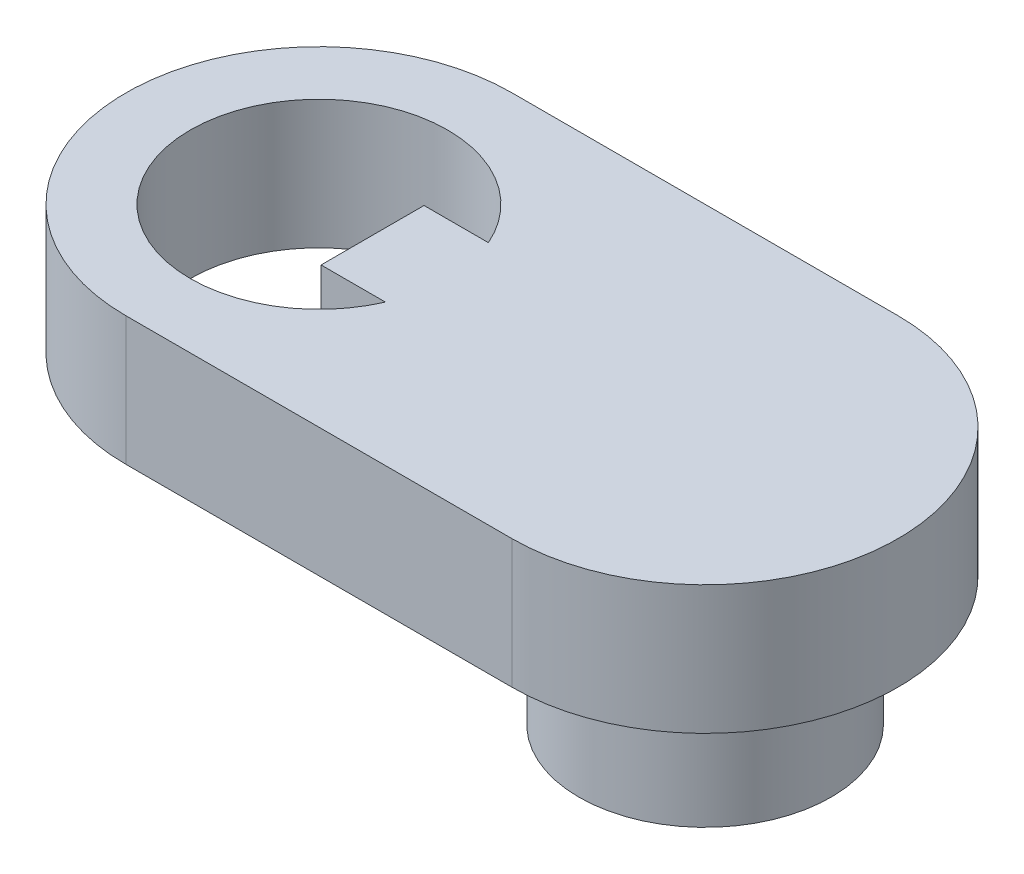
ISO-10303-21;
HEADER;
FILE_DESCRIPTION(('STEP AP214'),'2;1');
FILE_NAME('part.step','',(''),(''),'','','');
FILE_SCHEMA(('AUTOMOTIVE_DESIGN { 1 0 10303 214 1 1 1 1 }'));
ENDSEC;
DATA;
#1=APPLICATION_CONTEXT('core data for automotive mechanical design processes');
#2=APPLICATION_PROTOCOL_DEFINITION('international standard','automotive_design',2000,#1);
#3=PRODUCT_CONTEXT('',#1,'mechanical');
#4=PRODUCT('Part','Part','',(#3));
#5=PRODUCT_RELATED_PRODUCT_CATEGORY('part','',(#4));
#6=PRODUCT_DEFINITION_FORMATION('','',#4);
#7=PRODUCT_DEFINITION_CONTEXT('part definition',#1,'design');
#8=PRODUCT_DEFINITION('design','',#6,#7);
#9=PRODUCT_DEFINITION_SHAPE('','',#8);
#10=(LENGTH_UNIT() NAMED_UNIT(*) SI_UNIT(.MILLI.,.METRE.));
#11=(NAMED_UNIT(*) PLANE_ANGLE_UNIT() SI_UNIT($,.RADIAN.));
#12=(NAMED_UNIT(*) SI_UNIT($,.STERADIAN.) SOLID_ANGLE_UNIT());
#13=UNCERTAINTY_MEASURE_WITH_UNIT(LENGTH_MEASURE(1.E-05),#10,'distance_accuracy_value','');
#14=(GEOMETRIC_REPRESENTATION_CONTEXT(3) GLOBAL_UNCERTAINTY_ASSIGNED_CONTEXT((#13)) GLOBAL_UNIT_ASSIGNED_CONTEXT((#10,
#11,#12)) REPRESENTATION_CONTEXT('',''));
#15=CARTESIAN_POINT('',(0.,0.,0.));
#16=DIRECTION('',(0.,0.,1.));
#17=DIRECTION('',(1.,0.,0.));
#18=AXIS2_PLACEMENT_3D('',#15,#16,#17);
#19=CARTESIAN_POINT('',(15.,5.,-7.5));
#20=DIRECTION('',(0.,-1.,0.));
#21=DIRECTION('',(0.,0.,-1.));
#22=AXIS2_PLACEMENT_3D('',#19,#20,#21);
#23=CYLINDRICAL_SURFACE('',#22,5.);
#24=CARTESIAN_POINT('',(15.,0.,-7.5));
#25=DIRECTION('',(0.,1.,0.));
#26=DIRECTION('',(0.,0.,1.));
#27=AXIS2_PLACEMENT_3D('',#24,#25,#26);
#28=CIRCLE('',#27,5.);
#29=CARTESIAN_POINT('',(15.,0.,-2.5));
#30=VERTEX_POINT('',#29);
#31=EDGE_CURVE('E116',#30,#30,#28,.T.);
#32=ORIENTED_EDGE('',*,*,#31,.F.);
#33=EDGE_LOOP('',(#32));
#34=FACE_BOUND('',#33,.T.);
#35=CARTESIAN_POINT('',(15.,4.,-7.5));
#36=DIRECTION('',(0.,1.,0.));
#37=DIRECTION('',(0.,0.,1.));
#38=AXIS2_PLACEMENT_3D('',#35,#36,#37);
#39=CIRCLE('',#38,5.);
#40=CARTESIAN_POINT('',(15.,4.,-2.5));
#41=VERTEX_POINT('',#40);
#42=EDGE_CURVE('E129',#41,#41,#39,.T.);
#43=ORIENTED_EDGE('',*,*,#42,.T.);
#44=EDGE_LOOP('',(#43));
#45=FACE_BOUND('',#44,.T.);
#46=ADVANCED_FACE('F34',(#34,#45),#23,.F.);
#47=CARTESIAN_POINT('',(0.,5.,-7.5));
#48=DIRECTION('',(0.,1.,0.));
#49=DIRECTION('',(0.,0.,1.));
#50=AXIS2_PLACEMENT_3D('',#47,#48,#49);
#51=PLANE('',#50);
#52=CARTESIAN_POINT('',(0.,5.,-7.5));
#53=DIRECTION('',(0.,1.,0.));
#54=DIRECTION('',(0.,0.,1.));
#55=AXIS2_PLACEMENT_3D('',#52,#53,#54);
#56=CIRCLE('',#55,7.5);
#57=CARTESIAN_POINT('',(0.,5.,-15.));
#58=VERTEX_POINT('',#57);
#59=CARTESIAN_POINT('',(0.,5.,0.));
#60=VERTEX_POINT('',#59);
#61=EDGE_CURVE('E142',#58,#60,#56,.T.);
#62=ORIENTED_EDGE('',*,*,#61,.T.);
#63=DIRECTION('',(1.,0.,0.));
#64=VECTOR('',#63,1.);
#65=CARTESIAN_POINT('',(0.,5.,0.));
#66=LINE('',#65,#64);
#67=CARTESIAN_POINT('',(15.,5.,0.));
#68=VERTEX_POINT('',#67);
#69=EDGE_CURVE('E145',#60,#68,#66,.T.);
#70=ORIENTED_EDGE('',*,*,#69,.T.);
#71=CARTESIAN_POINT('',(15.,5.,-7.5));
#72=DIRECTION('',(0.,1.,0.));
#73=DIRECTION('',(0.,0.,1.));
#74=AXIS2_PLACEMENT_3D('',#71,#72,#73);
#75=CIRCLE('',#74,7.5);
#76=CARTESIAN_POINT('',(15.,5.,-15.));
#77=VERTEX_POINT('',#76);
#78=EDGE_CURVE('E148',#68,#77,#75,.T.);
#79=ORIENTED_EDGE('',*,*,#78,.T.);
#80=DIRECTION('',(-1.,0.,0.));
#81=VECTOR('',#80,1.);
#82=CARTESIAN_POINT('',(0.,5.,-15.));
#83=LINE('',#82,#81);
#84=EDGE_CURVE('E150',#77,#58,#83,.T.);
#85=ORIENTED_EDGE('',*,*,#84,.T.);
#86=EDGE_LOOP('',(#62,#70,#79,#85));
#87=FACE_BOUND('',#86,.T.);
#88=DIRECTION('',(-1.,0.,0.));
#89=VECTOR('',#88,1.);
#90=CARTESIAN_POINT('',(4.58257569495584,5.,-5.5));
#91=LINE('',#90,#89);
#92=CARTESIAN_POINT('',(4.58257569495584,5.,-5.5));
#93=VERTEX_POINT('',#92);
#94=CARTESIAN_POINT('',(2.08257569495584,5.,-5.5));
#95=VERTEX_POINT('',#94);
#96=EDGE_CURVE('E108',#93,#95,#91,.T.);
#97=ORIENTED_EDGE('',*,*,#96,.F.);
#98=CARTESIAN_POINT('',(0.,5.,-7.5));
#99=DIRECTION('',(0.,1.,0.));
#100=DIRECTION('',(0.,0.,1.));
#101=AXIS2_PLACEMENT_3D('',#98,#99,#100);
#102=CIRCLE('',#101,5.);
#103=CARTESIAN_POINT('',(4.58257569495584,5.,-9.5));
#104=VERTEX_POINT('',#103);
#105=EDGE_CURVE('E100',#104,#93,#102,.T.);
#106=ORIENTED_EDGE('',*,*,#105,.F.);
#107=DIRECTION('',(1.,0.,0.));
#108=VECTOR('',#107,1.);
#109=CARTESIAN_POINT('',(2.08257569495584,5.,-9.5));
#110=LINE('',#109,#108);
#111=CARTESIAN_POINT('',(2.08257569495584,5.,-9.5));
#112=VERTEX_POINT('',#111);
#113=EDGE_CURVE('E123',#112,#104,#110,.T.);
#114=ORIENTED_EDGE('',*,*,#113,.F.);
#115=DIRECTION('',(0.,0.,-1.));
#116=VECTOR('',#115,1.);
#117=CARTESIAN_POINT('',(2.08257569495584,5.,-5.5));
#118=LINE('',#117,#116);
#119=EDGE_CURVE('E121',#95,#112,#118,.T.);
#120=ORIENTED_EDGE('',*,*,#119,.F.);
#121=EDGE_LOOP('',(#97,#106,#114,#120));
#122=FACE_BOUND('',#121,.T.);
#123=ADVANCED_FACE('F120',(#87,#122),#51,.T.);
#124=CARTESIAN_POINT('',(0.,0.,-7.5));
#125=DIRECTION('',(0.,1.,0.));
#126=DIRECTION('',(0.,0.,1.));
#127=AXIS2_PLACEMENT_3D('',#124,#125,#126);
#128=PLANE('',#127);
#129=ORIENTED_EDGE('',*,*,#31,.T.);
#130=EDGE_LOOP('',(#129));
#131=FACE_BOUND('',#130,.T.);
#132=CARTESIAN_POINT('',(0.,0.,-7.5));
#133=DIRECTION('',(0.,1.,0.));
#134=DIRECTION('',(0.,0.,1.));
#135=AXIS2_PLACEMENT_3D('',#132,#133,#134);
#136=CIRCLE('',#135,7.5);
#137=CARTESIAN_POINT('',(0.,0.,-15.));
#138=VERTEX_POINT('',#137);
#139=CARTESIAN_POINT('',(0.,0.,0.));
#140=VERTEX_POINT('',#139);
#141=EDGE_CURVE('E141',#138,#140,#136,.T.);
#142=ORIENTED_EDGE('',*,*,#141,.F.);
#143=DIRECTION('',(-1.,0.,0.));
#144=VECTOR('',#143,1.);
#145=CARTESIAN_POINT('',(0.,0.,-15.));
#146=LINE('',#145,#144);
#147=CARTESIAN_POINT('',(15.,0.,-15.));
#148=VERTEX_POINT('',#147);
#149=EDGE_CURVE('E146',#148,#138,#146,.T.);
#150=ORIENTED_EDGE('',*,*,#149,.F.);
#151=CARTESIAN_POINT('',(15.,0.,-7.5));
#152=DIRECTION('',(0.,1.,0.));
#153=DIRECTION('',(0.,0.,1.));
#154=AXIS2_PLACEMENT_3D('',#151,#152,#153);
#155=CIRCLE('',#154,7.5);
#156=CARTESIAN_POINT('',(15.,0.,0.));
#157=VERTEX_POINT('',#156);
#158=EDGE_CURVE('E157',#157,#148,#155,.T.);
#159=ORIENTED_EDGE('',*,*,#158,.F.);
#160=DIRECTION('',(1.,0.,0.));
#161=VECTOR('',#160,1.);
#162=CARTESIAN_POINT('',(0.,0.,0.));
#163=LINE('',#162,#161);
#164=EDGE_CURVE('E155',#140,#157,#163,.T.);
#165=ORIENTED_EDGE('',*,*,#164,.F.);
#166=EDGE_LOOP('',(#142,#150,#159,#165));
#167=FACE_BOUND('',#166,.T.);
#168=CARTESIAN_POINT('',(0.,0.,-7.5));
#169=DIRECTION('',(0.,1.,0.));
#170=DIRECTION('',(0.,0.,1.));
#171=AXIS2_PLACEMENT_3D('',#168,#169,#170);
#172=CIRCLE('',#171,5.);
#173=CARTESIAN_POINT('',(4.58257569495584,0.,-9.5));
#174=VERTEX_POINT('',#173);
#175=CARTESIAN_POINT('',(4.58257569495584,0.,-5.5));
#176=VERTEX_POINT('',#175);
#177=EDGE_CURVE('E58',#174,#176,#172,.T.);
#178=ORIENTED_EDGE('',*,*,#177,.T.);
#179=DIRECTION('',(-1.,0.,0.));
#180=VECTOR('',#179,1.);
#181=CARTESIAN_POINT('',(4.58257569495584,0.,-5.5));
#182=LINE('',#181,#180);
#183=CARTESIAN_POINT('',(2.08257569495584,0.,-5.5));
#184=VERTEX_POINT('',#183);
#185=EDGE_CURVE('E115',#176,#184,#182,.T.);
#186=ORIENTED_EDGE('',*,*,#185,.T.);
#187=DIRECTION('',(0.,0.,-1.));
#188=VECTOR('',#187,1.);
#189=CARTESIAN_POINT('',(2.08257569495584,0.,-5.5));
#190=LINE('',#189,#188);
#191=CARTESIAN_POINT('',(2.08257569495584,0.,-9.5));
#192=VERTEX_POINT('',#191);
#193=EDGE_CURVE('E131',#184,#192,#190,.T.);
#194=ORIENTED_EDGE('',*,*,#193,.T.);
#195=DIRECTION('',(1.,0.,0.));
#196=VECTOR('',#195,1.);
#197=CARTESIAN_POINT('',(2.08257569495584,0.,-9.5));
#198=LINE('',#197,#196);
#199=EDGE_CURVE('E109',#192,#174,#198,.T.);
#200=ORIENTED_EDGE('',*,*,#199,.T.);
#201=EDGE_LOOP('',(#178,#186,#194,#200));
#202=FACE_BOUND('',#201,.T.);
#203=ADVANCED_FACE('F176',(#131,#167,#202),#128,.F.);
#204=CARTESIAN_POINT('',(0.,5.,-7.5));
#205=DIRECTION('',(0.,-1.,0.));
#206=DIRECTION('',(0.,0.,-1.));
#207=AXIS2_PLACEMENT_3D('',#204,#205,#206);
#208=CYLINDRICAL_SURFACE('',#207,7.5);
#209=ORIENTED_EDGE('',*,*,#141,.T.);
#210=DIRECTION('',(0.,-1.,0.));
#211=VECTOR('',#210,1.);
#212=CARTESIAN_POINT('',(0.,5.,0.));
#213=LINE('',#212,#211);
#214=EDGE_CURVE('E11',#60,#140,#213,.T.);
#215=ORIENTED_EDGE('',*,*,#214,.F.);
#216=ORIENTED_EDGE('',*,*,#61,.F.);
#217=DIRECTION('',(0.,-1.,0.));
#218=VECTOR('',#217,1.);
#219=CARTESIAN_POINT('',(0.,5.,-15.));
#220=LINE('',#219,#218);
#221=EDGE_CURVE('E152',#58,#138,#220,.T.);
#222=ORIENTED_EDGE('',*,*,#221,.T.);
#223=EDGE_LOOP('',(#209,#215,#216,#222));
#224=FACE_BOUND('',#223,.T.);
#225=ADVANCED_FACE('F36',(#224),#208,.T.);
#226=CARTESIAN_POINT('',(0.,5.,0.));
#227=DIRECTION('',(0.,0.,-1.));
#228=DIRECTION('',(-1.,0.,0.));
#229=AXIS2_PLACEMENT_3D('',#226,#227,#228);
#230=PLANE('',#229);
#231=ORIENTED_EDGE('',*,*,#164,.T.);
#232=DIRECTION('',(0.,-1.,0.));
#233=VECTOR('',#232,1.);
#234=CARTESIAN_POINT('',(15.,5.,0.));
#235=LINE('',#234,#233);
#236=EDGE_CURVE('E43',#68,#157,#235,.T.);
#237=ORIENTED_EDGE('',*,*,#236,.F.);
#238=ORIENTED_EDGE('',*,*,#69,.F.);
#239=ORIENTED_EDGE('',*,*,#214,.T.);
#240=EDGE_LOOP('',(#231,#237,#238,#239));
#241=FACE_BOUND('',#240,.T.);
#242=ADVANCED_FACE('F186',(#241),#230,.F.);
#243=CARTESIAN_POINT('',(15.,5.,-7.5));
#244=DIRECTION('',(0.,-1.,0.));
#245=DIRECTION('',(0.,0.,-1.));
#246=AXIS2_PLACEMENT_3D('',#243,#244,#245);
#247=CYLINDRICAL_SURFACE('',#246,7.5);
#248=ORIENTED_EDGE('',*,*,#158,.T.);
#249=DIRECTION('',(0.,-1.,0.));
#250=VECTOR('',#249,1.);
#251=CARTESIAN_POINT('',(15.,5.,-15.));
#252=LINE('',#251,#250);
#253=EDGE_CURVE('E162',#77,#148,#252,.T.);
#254=ORIENTED_EDGE('',*,*,#253,.F.);
#255=ORIENTED_EDGE('',*,*,#78,.F.);
#256=ORIENTED_EDGE('',*,*,#236,.T.);
#257=EDGE_LOOP('',(#248,#254,#255,#256));
#258=FACE_BOUND('',#257,.T.);
#259=ADVANCED_FACE('F170',(#258),#247,.T.);
#260=CARTESIAN_POINT('',(0.,5.,-15.));
#261=DIRECTION('',(0.,0.,1.));
#262=DIRECTION('',(1.,0.,0.));
#263=AXIS2_PLACEMENT_3D('',#260,#261,#262);
#264=PLANE('',#263);
#265=ORIENTED_EDGE('',*,*,#149,.T.);
#266=ORIENTED_EDGE('',*,*,#221,.F.);
#267=ORIENTED_EDGE('',*,*,#84,.F.);
#268=ORIENTED_EDGE('',*,*,#253,.T.);
#269=EDGE_LOOP('',(#265,#266,#267,#268));
#270=FACE_BOUND('',#269,.T.);
#271=ADVANCED_FACE('F180',(#270),#264,.F.);
#272=CARTESIAN_POINT('',(0.,5.,-7.5));
#273=DIRECTION('',(0.,-1.,0.));
#274=DIRECTION('',(0.,0.,-1.));
#275=AXIS2_PLACEMENT_3D('',#272,#273,#274);
#276=CYLINDRICAL_SURFACE('',#275,5.);
#277=ORIENTED_EDGE('',*,*,#177,.F.);
#278=DIRECTION('',(0.,-1.,0.));
#279=VECTOR('',#278,1.);
#280=CARTESIAN_POINT('',(4.58257569495584,5.,-9.5));
#281=LINE('',#280,#279);
#282=EDGE_CURVE('E104',#104,#174,#281,.T.);
#283=ORIENTED_EDGE('',*,*,#282,.F.);
#284=ORIENTED_EDGE('',*,*,#105,.T.);
#285=DIRECTION('',(0.,-1.,0.));
#286=VECTOR('',#285,1.);
#287=CARTESIAN_POINT('',(4.58257569495584,5.,-5.5));
#288=LINE('',#287,#286);
#289=EDGE_CURVE('E103',#93,#176,#288,.T.);
#290=ORIENTED_EDGE('',*,*,#289,.T.);
#291=EDGE_LOOP('',(#277,#283,#284,#290));
#292=FACE_BOUND('',#291,.T.);
#293=ADVANCED_FACE('F102',(#292),#276,.F.);
#294=CARTESIAN_POINT('',(4.58257569495584,5.,-5.5));
#295=DIRECTION('',(0.,0.,1.));
#296=DIRECTION('',(1.,0.,0.));
#297=AXIS2_PLACEMENT_3D('',#294,#295,#296);
#298=PLANE('',#297);
#299=ORIENTED_EDGE('',*,*,#185,.F.);
#300=ORIENTED_EDGE('',*,*,#289,.F.);
#301=ORIENTED_EDGE('',*,*,#96,.T.);
#302=DIRECTION('',(0.,-1.,0.));
#303=VECTOR('',#302,1.);
#304=CARTESIAN_POINT('',(2.08257569495584,5.,-5.5));
#305=LINE('',#304,#303);
#306=EDGE_CURVE('E117',#95,#184,#305,.T.);
#307=ORIENTED_EDGE('',*,*,#306,.T.);
#308=EDGE_LOOP('',(#299,#300,#301,#307));
#309=FACE_BOUND('',#308,.T.);
#310=ADVANCED_FACE('F112',(#309),#298,.T.);
#311=CARTESIAN_POINT('',(2.08257569495584,5.,-5.5));
#312=DIRECTION('',(-1.,0.,0.));
#313=DIRECTION('',(0.,0.,1.));
#314=AXIS2_PLACEMENT_3D('',#311,#312,#313);
#315=PLANE('',#314);
#316=ORIENTED_EDGE('',*,*,#193,.F.);
#317=ORIENTED_EDGE('',*,*,#306,.F.);
#318=ORIENTED_EDGE('',*,*,#119,.T.);
#319=DIRECTION('',(0.,-1.,0.));
#320=VECTOR('',#319,1.);
#321=CARTESIAN_POINT('',(2.08257569495584,5.,-9.5));
#322=LINE('',#321,#320);
#323=EDGE_CURVE('E50',#112,#192,#322,.T.);
#324=ORIENTED_EDGE('',*,*,#323,.T.);
#325=EDGE_LOOP('',(#316,#317,#318,#324));
#326=FACE_BOUND('',#325,.T.);
#327=ADVANCED_FACE('F215',(#326),#315,.T.);
#328=CARTESIAN_POINT('',(2.08257569495584,5.,-9.5));
#329=DIRECTION('',(0.,0.,-1.));
#330=DIRECTION('',(-1.,0.,0.));
#331=AXIS2_PLACEMENT_3D('',#328,#329,#330);
#332=PLANE('',#331);
#333=ORIENTED_EDGE('',*,*,#199,.F.);
#334=ORIENTED_EDGE('',*,*,#323,.F.);
#335=ORIENTED_EDGE('',*,*,#113,.T.);
#336=ORIENTED_EDGE('',*,*,#282,.T.);
#337=EDGE_LOOP('',(#333,#334,#335,#336));
#338=FACE_BOUND('',#337,.T.);
#339=ADVANCED_FACE('F219',(#338),#332,.T.);
#340=CARTESIAN_POINT('',(15.,4.,-7.5));
#341=DIRECTION('',(0.,1.,0.));
#342=DIRECTION('',(0.,0.,1.));
#343=AXIS2_PLACEMENT_3D('',#340,#341,#342);
#344=PLANE('',#343);
#345=CARTESIAN_POINT('',(15.,4.,-7.5));
#346=DIRECTION('',(0.,1.,0.));
#347=DIRECTION('',(0.,0.,1.));
#348=AXIS2_PLACEMENT_3D('',#345,#346,#347);
#349=CIRCLE('',#348,4.9);
#350=CARTESIAN_POINT('',(15.,4.,-2.6));
#351=VERTEX_POINT('',#350);
#352=EDGE_CURVE('E38',#351,#351,#349,.T.);
#353=ORIENTED_EDGE('',*,*,#352,.T.);
#354=EDGE_LOOP('',(#353));
#355=FACE_BOUND('',#354,.T.);
#356=ORIENTED_EDGE('',*,*,#42,.F.);
#357=EDGE_LOOP('',(#356));
#358=FACE_BOUND('',#357,.T.);
#359=ADVANCED_FACE('F225',(#355,#358),#344,.F.);
#360=CARTESIAN_POINT('',(15.,-5.,-7.5));
#361=DIRECTION('',(0.,1.,0.));
#362=DIRECTION('',(0.,0.,1.));
#363=AXIS2_PLACEMENT_3D('',#360,#361,#362);
#364=CYLINDRICAL_SURFACE('',#363,4.9);
#365=CARTESIAN_POINT('',(15.,-5.,-7.5));
#366=DIRECTION('',(0.,1.,0.));
#367=DIRECTION('',(0.,0.,1.));
#368=AXIS2_PLACEMENT_3D('',#365,#366,#367);
#369=CIRCLE('',#368,4.9);
#370=CARTESIAN_POINT('',(15.,-5.,-2.6));
#371=VERTEX_POINT('',#370);
#372=EDGE_CURVE('E240',#371,#371,#369,.T.);
#373=ORIENTED_EDGE('',*,*,#372,.T.);
#374=EDGE_LOOP('',(#373));
#375=FACE_BOUND('',#374,.T.);
#376=ORIENTED_EDGE('',*,*,#352,.F.);
#377=EDGE_LOOP('',(#376));
#378=FACE_BOUND('',#377,.T.);
#379=ADVANCED_FACE('F228',(#375,#378),#364,.T.);
#380=CARTESIAN_POINT('',(15.,-5.,-7.5));
#381=DIRECTION('',(0.,1.,0.));
#382=DIRECTION('',(0.,0.,1.));
#383=AXIS2_PLACEMENT_3D('',#380,#381,#382);
#384=PLANE('',#383);
#385=ORIENTED_EDGE('',*,*,#372,.F.);
#386=EDGE_LOOP('',(#385));
#387=FACE_BOUND('',#386,.T.);
#388=ADVANCED_FACE('F232',(#387),#384,.F.);
#389=CLOSED_SHELL('',(#46,#123,#203,#225,#242,#259,#271,#293,#310,#327,#339,#359,#379,#388));
#390=MANIFOLD_SOLID_BREP('B2',#389);
#391=ADVANCED_BREP_SHAPE_REPRESENTATION('',(#18,#390),#14);
#392=SHAPE_DEFINITION_REPRESENTATION(#9,#391);
ENDSEC;
END-ISO-10303-21;
